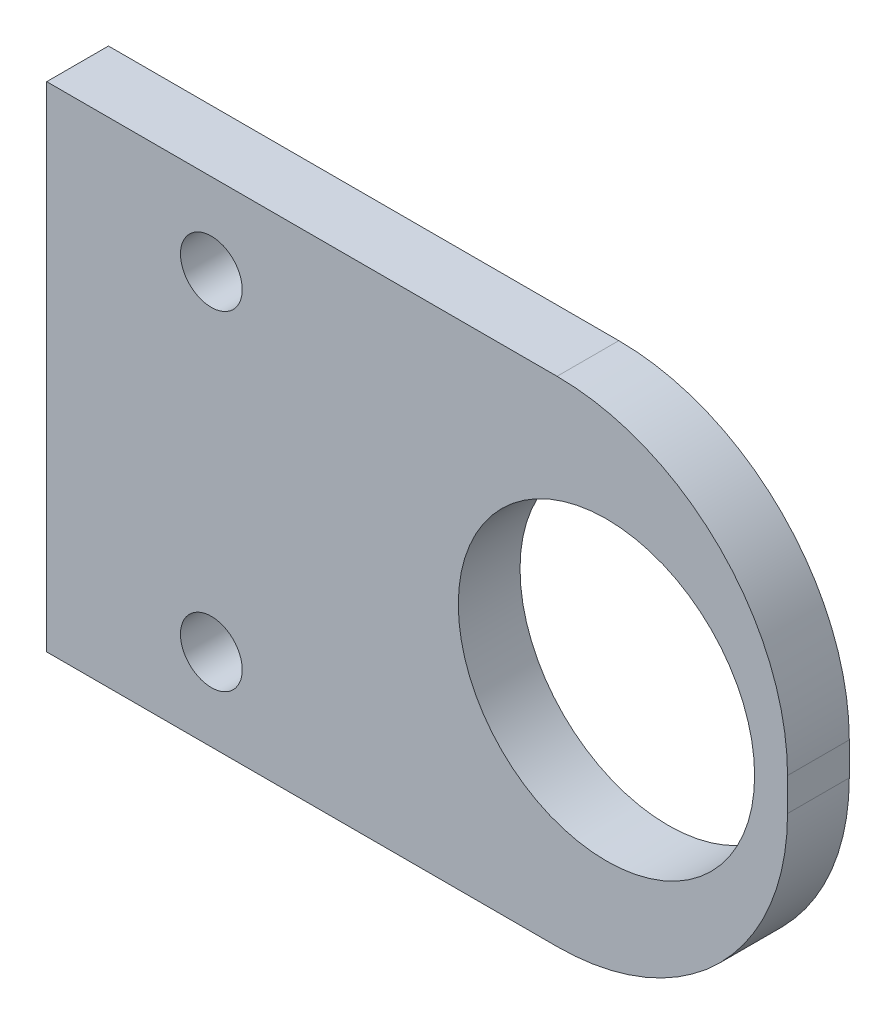
ISO-10303-21;
HEADER;
FILE_DESCRIPTION(('STEP AP214'),'2;1');
FILE_NAME('part.step','',(''),(''),'','','');
FILE_SCHEMA(('AUTOMOTIVE_DESIGN { 1 0 10303 214 1 1 1 1 }'));
ENDSEC;
DATA;
#1=APPLICATION_CONTEXT('core data for automotive mechanical design processes');
#2=APPLICATION_PROTOCOL_DEFINITION('international standard','automotive_design',2000,#1);
#3=PRODUCT_CONTEXT('',#1,'mechanical');
#4=PRODUCT('Part','Part','',(#3));
#5=PRODUCT_RELATED_PRODUCT_CATEGORY('part','',(#4));
#6=PRODUCT_DEFINITION_FORMATION('','',#4);
#7=PRODUCT_DEFINITION_CONTEXT('part definition',#1,'design');
#8=PRODUCT_DEFINITION('design','',#6,#7);
#9=PRODUCT_DEFINITION_SHAPE('','',#8);
#10=(LENGTH_UNIT() NAMED_UNIT(*) SI_UNIT(.MILLI.,.METRE.));
#11=(NAMED_UNIT(*) PLANE_ANGLE_UNIT() SI_UNIT($,.RADIAN.));
#12=(NAMED_UNIT(*) SI_UNIT($,.STERADIAN.) SOLID_ANGLE_UNIT());
#13=UNCERTAINTY_MEASURE_WITH_UNIT(LENGTH_MEASURE(1.E-05),#10,'distance_accuracy_value','');
#14=(GEOMETRIC_REPRESENTATION_CONTEXT(3) GLOBAL_UNCERTAINTY_ASSIGNED_CONTEXT((#13)) GLOBAL_UNIT_ASSIGNED_CONTEXT((#10,
#11,#12)) REPRESENTATION_CONTEXT('',''));
#15=CARTESIAN_POINT('',(0.,0.,0.));
#16=DIRECTION('',(0.,0.,1.));
#17=DIRECTION('',(1.,0.,0.));
#18=AXIS2_PLACEMENT_3D('',#15,#16,#17);
#19=CARTESIAN_POINT('',(10.795,-1.27000000000001,4.7625));
#20=DIRECTION('',(0.,0.,1.));
#21=DIRECTION('',(1.,0.,0.));
#22=AXIS2_PLACEMENT_3D('',#19,#20,#21);
#23=PLANE('',#22);
#24=CARTESIAN_POINT('',(-15.875,12.7,4.7625));
#25=DIRECTION('',(0.,0.,1.));
#26=DIRECTION('',(1.,0.,0.));
#27=AXIS2_PLACEMENT_3D('',#24,#25,#26);
#28=CIRCLE('',#27,2.38125);
#29=CARTESIAN_POINT('',(-18.25625,12.7,4.7625));
#30=VERTEX_POINT('',#29);
#31=EDGE_CURVE('E148',#30,#30,#28,.T.);
#32=ORIENTED_EDGE('',*,*,#31,.F.);
#33=EDGE_LOOP('',(#32));
#34=FACE_BOUND('',#33,.T.);
#35=DIRECTION('',(0.,-1.,0.));
#36=VECTOR('',#35,1.);
#37=CARTESIAN_POINT('',(-28.575,19.05,4.7625));
#38=LINE('',#37,#36);
#39=CARTESIAN_POINT('',(-28.575,19.05,4.7625));
#40=VERTEX_POINT('',#39);
#41=CARTESIAN_POINT('',(-28.575,-19.05,4.7625));
#42=VERTEX_POINT('',#41);
#43=EDGE_CURVE('E149',#40,#42,#38,.T.);
#44=ORIENTED_EDGE('',*,*,#43,.T.);
#45=DIRECTION('',(1.,0.,0.));
#46=VECTOR('',#45,1.);
#47=CARTESIAN_POINT('',(-28.575,-19.05,4.7625));
#48=LINE('',#47,#46);
#49=CARTESIAN_POINT('',(10.7949999999999,-19.05,4.7625));
#50=VERTEX_POINT('',#49);
#51=EDGE_CURVE('E94',#42,#50,#48,.T.);
#52=ORIENTED_EDGE('',*,*,#51,.T.);
#53=CARTESIAN_POINT('',(10.795,-1.27000000000001,4.7625));
#54=DIRECTION('',(0.,0.,1.));
#55=DIRECTION('',(1.,0.,0.));
#56=AXIS2_PLACEMENT_3D('',#53,#54,#55);
#57=CIRCLE('',#56,17.78);
#58=CARTESIAN_POINT('',(28.575,-1.26999999999988,4.7625));
#59=VERTEX_POINT('',#58);
#60=EDGE_CURVE('E107',#50,#59,#57,.T.);
#61=ORIENTED_EDGE('',*,*,#60,.T.);
#62=DIRECTION('',(0.,1.,0.));
#63=VECTOR('',#62,1.);
#64=CARTESIAN_POINT('',(28.575,1.26999999999988,4.7625));
#65=LINE('',#64,#63);
#66=CARTESIAN_POINT('',(28.575,1.26999999999989,4.7625));
#67=VERTEX_POINT('',#66);
#68=EDGE_CURVE('E101',#59,#67,#65,.T.);
#69=ORIENTED_EDGE('',*,*,#68,.T.);
#70=CARTESIAN_POINT('',(10.795,1.27,4.7625));
#71=DIRECTION('',(0.,0.,1.));
#72=DIRECTION('',(-1.,0.,0.));
#73=AXIS2_PLACEMENT_3D('',#70,#71,#72);
#74=CIRCLE('',#73,17.78);
#75=CARTESIAN_POINT('',(10.7949999999999,19.05,4.7625));
#76=VERTEX_POINT('',#75);
#77=EDGE_CURVE('E105',#67,#76,#74,.T.);
#78=ORIENTED_EDGE('',*,*,#77,.T.);
#79=DIRECTION('',(-1.,0.,0.));
#80=VECTOR('',#79,1.);
#81=CARTESIAN_POINT('',(-28.575,19.05,4.7625));
#82=LINE('',#81,#80);
#83=EDGE_CURVE('E57',#76,#40,#82,.T.);
#84=ORIENTED_EDGE('',*,*,#83,.T.);
#85=EDGE_LOOP('',(#44,#52,#61,#69,#78,#84));
#86=FACE_BOUND('',#85,.T.);
#87=CARTESIAN_POINT('',(14.605,0.,4.7625));
#88=DIRECTION('',(0.,0.,1.));
#89=DIRECTION('',(1.,0.,0.));
#90=AXIS2_PLACEMENT_3D('',#87,#88,#89);
#91=CIRCLE('',#90,11.43);
#92=CARTESIAN_POINT('',(3.17500000000001,0.,4.7625));
#93=VERTEX_POINT('',#92);
#94=EDGE_CURVE('E136',#93,#93,#91,.T.);
#95=ORIENTED_EDGE('',*,*,#94,.F.);
#96=EDGE_LOOP('',(#95));
#97=FACE_BOUND('',#96,.T.);
#98=CARTESIAN_POINT('',(-15.875,-12.7,4.7625));
#99=DIRECTION('',(0.,0.,1.));
#100=DIRECTION('',(1.,0.,0.));
#101=AXIS2_PLACEMENT_3D('',#98,#99,#100);
#102=CIRCLE('',#101,2.38125);
#103=CARTESIAN_POINT('',(-18.25625,-12.7,4.7625));
#104=VERTEX_POINT('',#103);
#105=EDGE_CURVE('E194',#104,#104,#102,.T.);
#106=ORIENTED_EDGE('',*,*,#105,.F.);
#107=EDGE_LOOP('',(#106));
#108=FACE_BOUND('',#107,.T.);
#109=ADVANCED_FACE('F40',(#34,#86,#97,#108),#23,.T.);
#110=CARTESIAN_POINT('',(10.795,-1.27000000000001,0.));
#111=DIRECTION('',(0.,0.,1.));
#112=DIRECTION('',(1.,0.,0.));
#113=AXIS2_PLACEMENT_3D('',#110,#111,#112);
#114=PLANE('',#113);
#115=DIRECTION('',(0.,-1.,0.));
#116=VECTOR('',#115,1.);
#117=CARTESIAN_POINT('',(-28.575,19.05,0.));
#118=LINE('',#117,#116);
#119=CARTESIAN_POINT('',(-28.575,19.05,0.));
#120=VERTEX_POINT('',#119);
#121=CARTESIAN_POINT('',(-28.575,-19.05,0.));
#122=VERTEX_POINT('',#121);
#123=EDGE_CURVE('E142',#120,#122,#118,.T.);
#124=ORIENTED_EDGE('',*,*,#123,.F.);
#125=DIRECTION('',(-1.,0.,0.));
#126=VECTOR('',#125,1.);
#127=CARTESIAN_POINT('',(-28.575,19.05,0.));
#128=LINE('',#127,#126);
#129=CARTESIAN_POINT('',(10.7949999999999,19.05,0.));
#130=VERTEX_POINT('',#129);
#131=EDGE_CURVE('E86',#130,#120,#128,.T.);
#132=ORIENTED_EDGE('',*,*,#131,.F.);
#133=CARTESIAN_POINT('',(10.795,1.27,0.));
#134=DIRECTION('',(0.,0.,1.));
#135=DIRECTION('',(-1.,0.,0.));
#136=AXIS2_PLACEMENT_3D('',#133,#134,#135);
#137=CIRCLE('',#136,17.78);
#138=CARTESIAN_POINT('',(28.575,1.26999999999989,0.));
#139=VERTEX_POINT('',#138);
#140=EDGE_CURVE('E80',#139,#130,#137,.T.);
#141=ORIENTED_EDGE('',*,*,#140,.F.);
#142=DIRECTION('',(0.,1.,0.));
#143=VECTOR('',#142,1.);
#144=CARTESIAN_POINT('',(28.575,1.26999999999988,0.));
#145=LINE('',#144,#143);
#146=CARTESIAN_POINT('',(28.575,-1.26999999999988,0.));
#147=VERTEX_POINT('',#146);
#148=EDGE_CURVE('E116',#147,#139,#145,.T.);
#149=ORIENTED_EDGE('',*,*,#148,.F.);
#150=CARTESIAN_POINT('',(10.795,-1.27000000000001,0.));
#151=DIRECTION('',(0.,0.,1.));
#152=DIRECTION('',(1.,0.,0.));
#153=AXIS2_PLACEMENT_3D('',#150,#151,#152);
#154=CIRCLE('',#153,17.78);
#155=CARTESIAN_POINT('',(10.7949999999999,-19.05,0.));
#156=VERTEX_POINT('',#155);
#157=EDGE_CURVE('E168',#156,#147,#154,.T.);
#158=ORIENTED_EDGE('',*,*,#157,.F.);
#159=DIRECTION('',(1.,0.,0.));
#160=VECTOR('',#159,1.);
#161=CARTESIAN_POINT('',(-28.575,-19.05,0.));
#162=LINE('',#161,#160);
#163=EDGE_CURVE('E164',#122,#156,#162,.T.);
#164=ORIENTED_EDGE('',*,*,#163,.F.);
#165=EDGE_LOOP('',(#124,#132,#141,#149,#158,#164));
#166=FACE_BOUND('',#165,.T.);
#167=CARTESIAN_POINT('',(14.605,0.,0.));
#168=DIRECTION('',(0.,0.,1.));
#169=DIRECTION('',(1.,0.,0.));
#170=AXIS2_PLACEMENT_3D('',#167,#168,#169);
#171=CIRCLE('',#170,11.43);
#172=CARTESIAN_POINT('',(3.17500000000001,0.,0.));
#173=VERTEX_POINT('',#172);
#174=EDGE_CURVE('E143',#173,#173,#171,.T.);
#175=ORIENTED_EDGE('',*,*,#174,.T.);
#176=EDGE_LOOP('',(#175));
#177=FACE_BOUND('',#176,.T.);
#178=CARTESIAN_POINT('',(-15.875,12.7,0.));
#179=DIRECTION('',(0.,0.,1.));
#180=DIRECTION('',(1.,0.,0.));
#181=AXIS2_PLACEMENT_3D('',#178,#179,#180);
#182=CIRCLE('',#181,2.38125);
#183=CARTESIAN_POINT('',(-18.25625,12.7,0.));
#184=VERTEX_POINT('',#183);
#185=EDGE_CURVE('E144',#184,#184,#182,.T.);
#186=ORIENTED_EDGE('',*,*,#185,.T.);
#187=EDGE_LOOP('',(#186));
#188=FACE_BOUND('',#187,.T.);
#189=CARTESIAN_POINT('',(-15.875,-12.7,0.));
#190=DIRECTION('',(0.,0.,1.));
#191=DIRECTION('',(1.,0.,0.));
#192=AXIS2_PLACEMENT_3D('',#189,#190,#191);
#193=CIRCLE('',#192,2.38125);
#194=CARTESIAN_POINT('',(-18.25625,-12.7,0.));
#195=VERTEX_POINT('',#194);
#196=EDGE_CURVE('E192',#195,#195,#193,.T.);
#197=ORIENTED_EDGE('',*,*,#196,.T.);
#198=EDGE_LOOP('',(#197));
#199=FACE_BOUND('',#198,.T.);
#200=ADVANCED_FACE('F181',(#166,#177,#188,#199),#114,.F.);
#201=CARTESIAN_POINT('',(-28.575,19.05,4.7625));
#202=DIRECTION('',(1.,0.,0.));
#203=DIRECTION('',(0.,1.,0.));
#204=AXIS2_PLACEMENT_3D('',#201,#202,#203);
#205=PLANE('',#204);
#206=ORIENTED_EDGE('',*,*,#123,.T.);
#207=DIRECTION('',(0.,0.,-1.));
#208=VECTOR('',#207,1.);
#209=CARTESIAN_POINT('',(-28.575,-19.05,4.7625));
#210=LINE('',#209,#208);
#211=EDGE_CURVE('E12',#42,#122,#210,.T.);
#212=ORIENTED_EDGE('',*,*,#211,.F.);
#213=ORIENTED_EDGE('',*,*,#43,.F.);
#214=DIRECTION('',(0.,0.,-1.));
#215=VECTOR('',#214,1.);
#216=CARTESIAN_POINT('',(-28.575,19.05,4.7625));
#217=LINE('',#216,#215);
#218=EDGE_CURVE('E124',#40,#120,#217,.T.);
#219=ORIENTED_EDGE('',*,*,#218,.T.);
#220=EDGE_LOOP('',(#206,#212,#213,#219));
#221=FACE_BOUND('',#220,.T.);
#222=ADVANCED_FACE('F42',(#221),#205,.F.);
#223=CARTESIAN_POINT('',(-28.575,-19.05,4.7625));
#224=DIRECTION('',(0.,1.,0.));
#225=DIRECTION('',(0.,0.,1.));
#226=AXIS2_PLACEMENT_3D('',#223,#224,#225);
#227=PLANE('',#226);
#228=ORIENTED_EDGE('',*,*,#163,.T.);
#229=DIRECTION('',(0.,0.,-1.));
#230=VECTOR('',#229,1.);
#231=CARTESIAN_POINT('',(10.7949999999999,-19.05,4.7625));
#232=LINE('',#231,#230);
#233=EDGE_CURVE('E49',#50,#156,#232,.T.);
#234=ORIENTED_EDGE('',*,*,#233,.F.);
#235=ORIENTED_EDGE('',*,*,#51,.F.);
#236=ORIENTED_EDGE('',*,*,#211,.T.);
#237=EDGE_LOOP('',(#228,#234,#235,#236));
#238=FACE_BOUND('',#237,.T.);
#239=ADVANCED_FACE('F163',(#238),#227,.F.);
#240=CARTESIAN_POINT('',(10.795,-1.27000000000001,4.7625));
#241=DIRECTION('',(0.,0.,-1.));
#242=DIRECTION('',(-1.,0.,0.));
#243=AXIS2_PLACEMENT_3D('',#240,#241,#242);
#244=CYLINDRICAL_SURFACE('',#243,17.78);
#245=ORIENTED_EDGE('',*,*,#157,.T.);
#246=DIRECTION('',(0.,0.,-1.));
#247=VECTOR('',#246,1.);
#248=CARTESIAN_POINT('',(28.575,-1.26999999999988,4.7625));
#249=LINE('',#248,#247);
#250=EDGE_CURVE('E117',#59,#147,#249,.T.);
#251=ORIENTED_EDGE('',*,*,#250,.F.);
#252=ORIENTED_EDGE('',*,*,#60,.F.);
#253=ORIENTED_EDGE('',*,*,#233,.T.);
#254=EDGE_LOOP('',(#245,#251,#252,#253));
#255=FACE_BOUND('',#254,.T.);
#256=ADVANCED_FACE('F167',(#255),#244,.T.);
#257=CARTESIAN_POINT('',(28.575,1.26999999999988,4.7625));
#258=DIRECTION('',(-1.,0.,0.));
#259=DIRECTION('',(0.,0.,1.));
#260=AXIS2_PLACEMENT_3D('',#257,#258,#259);
#261=PLANE('',#260);
#262=ORIENTED_EDGE('',*,*,#148,.T.);
#263=DIRECTION('',(0.,0.,-1.));
#264=VECTOR('',#263,1.);
#265=CARTESIAN_POINT('',(28.575,1.26999999999989,4.7625));
#266=LINE('',#265,#264);
#267=EDGE_CURVE('E113',#67,#139,#266,.T.);
#268=ORIENTED_EDGE('',*,*,#267,.F.);
#269=ORIENTED_EDGE('',*,*,#68,.F.);
#270=ORIENTED_EDGE('',*,*,#250,.T.);
#271=EDGE_LOOP('',(#262,#268,#269,#270));
#272=FACE_BOUND('',#271,.T.);
#273=ADVANCED_FACE('F114',(#272),#261,.F.);
#274=CARTESIAN_POINT('',(10.795,1.27,4.7625));
#275=DIRECTION('',(0.,0.,-1.));
#276=DIRECTION('',(-1.,0.,0.));
#277=AXIS2_PLACEMENT_3D('',#274,#275,#276);
#278=CYLINDRICAL_SURFACE('',#277,17.78);
#279=ORIENTED_EDGE('',*,*,#140,.T.);
#280=DIRECTION('',(0.,0.,-1.));
#281=VECTOR('',#280,1.);
#282=CARTESIAN_POINT('',(10.7949999999999,19.05,4.7625));
#283=LINE('',#282,#281);
#284=EDGE_CURVE('E118',#76,#130,#283,.T.);
#285=ORIENTED_EDGE('',*,*,#284,.F.);
#286=ORIENTED_EDGE('',*,*,#77,.F.);
#287=ORIENTED_EDGE('',*,*,#267,.T.);
#288=EDGE_LOOP('',(#279,#285,#286,#287));
#289=FACE_BOUND('',#288,.T.);
#290=ADVANCED_FACE('F120',(#289),#278,.T.);
#291=CARTESIAN_POINT('',(-28.575,19.05,4.7625));
#292=DIRECTION('',(0.,-1.,0.));
#293=DIRECTION('',(0.,0.,-1.));
#294=AXIS2_PLACEMENT_3D('',#291,#292,#293);
#295=PLANE('',#294);
#296=ORIENTED_EDGE('',*,*,#131,.T.);
#297=ORIENTED_EDGE('',*,*,#218,.F.);
#298=ORIENTED_EDGE('',*,*,#83,.F.);
#299=ORIENTED_EDGE('',*,*,#284,.T.);
#300=EDGE_LOOP('',(#296,#297,#298,#299));
#301=FACE_BOUND('',#300,.T.);
#302=ADVANCED_FACE('F215',(#301),#295,.F.);
#303=CARTESIAN_POINT('',(14.605,0.,4.7625));
#304=DIRECTION('',(0.,0.,-1.));
#305=DIRECTION('',(-1.,0.,0.));
#306=AXIS2_PLACEMENT_3D('',#303,#304,#305);
#307=CYLINDRICAL_SURFACE('',#306,11.43);
#308=CARTESIAN_POINT('',(3.17500000000001,0.,4.7625));
#309=CARTESIAN_POINT('',(3.17500000000001,0.,4.712890625));
#310=CARTESIAN_POINT('',(3.17500000000001,0.,4.66328125));
#311=CARTESIAN_POINT('',(3.17500000000001,0.,4.5640625));
#312=CARTESIAN_POINT('',(3.17500000000001,0.,4.514453125));
#313=CARTESIAN_POINT('',(3.17500000000001,0.,4.415234375));
#314=CARTESIAN_POINT('',(3.17500000000001,0.,4.365625));
#315=CARTESIAN_POINT('',(3.17500000000001,0.,4.26640625));
#316=CARTESIAN_POINT('',(3.17500000000001,0.,4.216796875));
#317=CARTESIAN_POINT('',(3.17500000000001,0.,4.117578125));
#318=CARTESIAN_POINT('',(3.17500000000001,0.,4.06796875));
#319=CARTESIAN_POINT('',(3.17500000000001,0.,3.96875));
#320=CARTESIAN_POINT('',(3.17500000000001,0.,3.919140625));
#321=CARTESIAN_POINT('',(3.17500000000001,0.,3.819921875));
#322=CARTESIAN_POINT('',(3.17500000000001,0.,3.7703125));
#323=CARTESIAN_POINT('',(3.17500000000001,0.,3.67109375));
#324=CARTESIAN_POINT('',(3.17500000000001,0.,3.621484375));
#325=CARTESIAN_POINT('',(3.17500000000001,0.,3.522265625));
#326=CARTESIAN_POINT('',(3.17500000000001,0.,3.47265625));
#327=CARTESIAN_POINT('',(3.17500000000001,0.,3.3734375));
#328=CARTESIAN_POINT('',(3.17500000000001,0.,3.323828125));
#329=CARTESIAN_POINT('',(3.17500000000001,0.,3.224609375));
#330=CARTESIAN_POINT('',(3.17500000000001,0.,3.175));
#331=CARTESIAN_POINT('',(3.17500000000001,0.,3.07578125));
#332=CARTESIAN_POINT('',(3.17500000000001,0.,3.026171875));
#333=CARTESIAN_POINT('',(3.17500000000001,0.,2.926953125));
#334=CARTESIAN_POINT('',(3.17500000000001,0.,2.87734375));
#335=CARTESIAN_POINT('',(3.17500000000001,0.,2.778125));
#336=CARTESIAN_POINT('',(3.17500000000001,0.,2.728515625));
#337=CARTESIAN_POINT('',(3.17500000000001,0.,2.629296875));
#338=CARTESIAN_POINT('',(3.17500000000001,0.,2.5796875));
#339=CARTESIAN_POINT('',(3.17500000000001,0.,2.48046875));
#340=CARTESIAN_POINT('',(3.17500000000001,0.,2.430859375));
#341=CARTESIAN_POINT('',(3.17500000000001,0.,2.331640625));
#342=CARTESIAN_POINT('',(3.17500000000001,0.,2.28203125));
#343=CARTESIAN_POINT('',(3.17500000000001,0.,2.1828125));
#344=CARTESIAN_POINT('',(3.17500000000001,0.,2.133203125));
#345=CARTESIAN_POINT('',(3.17500000000001,0.,2.033984375));
#346=CARTESIAN_POINT('',(3.17500000000001,0.,1.984375));
#347=CARTESIAN_POINT('',(3.17500000000001,0.,1.88515625));
#348=CARTESIAN_POINT('',(3.17500000000001,0.,1.835546875));
#349=CARTESIAN_POINT('',(3.17500000000001,0.,1.736328125));
#350=CARTESIAN_POINT('',(3.17500000000001,0.,1.68671875));
#351=CARTESIAN_POINT('',(3.17500000000001,0.,1.5875));
#352=CARTESIAN_POINT('',(3.17500000000001,0.,1.537890625));
#353=CARTESIAN_POINT('',(3.17500000000001,0.,1.438671875));
#354=CARTESIAN_POINT('',(3.17500000000001,0.,1.3890625));
#355=CARTESIAN_POINT('',(3.17500000000001,0.,1.28984375));
#356=CARTESIAN_POINT('',(3.17500000000001,0.,1.240234375));
#357=CARTESIAN_POINT('',(3.17500000000001,0.,1.141015625));
#358=CARTESIAN_POINT('',(3.17500000000001,0.,1.09140625));
#359=CARTESIAN_POINT('',(3.17500000000001,0.,0.9921875));
#360=CARTESIAN_POINT('',(3.17500000000001,0.,0.942578125));
#361=CARTESIAN_POINT('',(3.17500000000001,0.,0.843359375));
#362=CARTESIAN_POINT('',(3.17500000000001,0.,0.79375));
#363=CARTESIAN_POINT('',(3.17500000000001,0.,0.69453125));
#364=CARTESIAN_POINT('',(3.17500000000001,0.,0.644921875));
#365=CARTESIAN_POINT('',(3.17500000000001,0.,0.545703125));
#366=CARTESIAN_POINT('',(3.17500000000001,0.,0.49609375));
#367=CARTESIAN_POINT('',(3.17500000000001,0.,0.396875));
#368=CARTESIAN_POINT('',(3.17500000000001,0.,0.347265625));
#369=CARTESIAN_POINT('',(3.17500000000001,0.,0.248046875));
#370=CARTESIAN_POINT('',(3.17500000000001,0.,0.1984375));
#371=CARTESIAN_POINT('',(3.17500000000001,0.,0.09921875));
#372=CARTESIAN_POINT('',(3.17500000000001,0.,0.049609375));
#373=CARTESIAN_POINT('',(3.17500000000001,0.,0.));
#374=B_SPLINE_CURVE_WITH_KNOTS('',3,(#308,#309,#310,#311,#312,#313,#314,#315,#316,#317,#318,
#319,#320,#321,#322,#323,#324,#325,#326,#327,#328,#329,#330,#331,#332,#333,#334,#335,#336,#337,
#338,#339,#340,#341,#342,#343,#344,#345,#346,#347,#348,#349,#350,#351,#352,#353,#354,#355,#356,
#357,#358,#359,#360,#361,#362,#363,#364,#365,#366,#367,#368,#369,#370,#371,#372,#373),
.UNSPECIFIED.,.F.,.F.,(4,2,2,2,2,2,2,2,2,2,2,2,2,2,2,2,2,2,2,2,2,2,2,2,2,2,2,2,2,2,2,2,4),(0.,
0.148828124999999,0.297656249999999,0.446484374999999,0.595312499999999,0.744140625,0.89296875,
1.041796875,1.190625,1.339453125,1.48828125,1.637109375,1.7859375,1.934765625,2.08359375,
2.232421875,2.38125,2.530078125,2.67890625,2.827734375,2.9765625,3.125390625,3.27421875,
3.423046875,3.571875,3.720703125,3.86953125,4.018359375,4.1671875,4.316015625,4.46484375,
4.613671875,4.7625),.UNSPECIFIED.);
#375=EDGE_CURVE('BSEAM212',#93,#173,#374,.T.);
#376=ORIENTED_EDGE('',*,*,#94,.T.);
#377=ORIENTED_EDGE('',*,*,#174,.F.);
#378=ORIENTED_EDGE('',*,*,#375,.T.);
#379=ORIENTED_EDGE('',*,*,#375,.F.);
#380=EDGE_LOOP('',(#376,#378,#377,#379));
#381=FACE_BOUND('',#380,.T.);
#382=ADVANCED_FACE('F212',(#381),#307,.F.);
#383=CARTESIAN_POINT('',(-15.875,12.7,4.7625));
#384=DIRECTION('',(0.,0.,-1.));
#385=DIRECTION('',(-1.,0.,0.));
#386=AXIS2_PLACEMENT_3D('',#383,#384,#385);
#387=CYLINDRICAL_SURFACE('',#386,2.38125);
#388=CARTESIAN_POINT('',(-18.25625,12.7,4.7625));
#389=CARTESIAN_POINT('',(-18.25625,12.7,4.712890625));
#390=CARTESIAN_POINT('',(-18.25625,12.7,4.66328125));
#391=CARTESIAN_POINT('',(-18.25625,12.7,4.5640625));
#392=CARTESIAN_POINT('',(-18.25625,12.7,4.514453125));
#393=CARTESIAN_POINT('',(-18.25625,12.7,4.415234375));
#394=CARTESIAN_POINT('',(-18.25625,12.7,4.365625));
#395=CARTESIAN_POINT('',(-18.25625,12.7,4.26640625));
#396=CARTESIAN_POINT('',(-18.25625,12.7,4.216796875));
#397=CARTESIAN_POINT('',(-18.25625,12.7,4.117578125));
#398=CARTESIAN_POINT('',(-18.25625,12.7,4.06796875));
#399=CARTESIAN_POINT('',(-18.25625,12.7,3.96875));
#400=CARTESIAN_POINT('',(-18.25625,12.7,3.919140625));
#401=CARTESIAN_POINT('',(-18.25625,12.7,3.819921875));
#402=CARTESIAN_POINT('',(-18.25625,12.7,3.7703125));
#403=CARTESIAN_POINT('',(-18.25625,12.7,3.67109375));
#404=CARTESIAN_POINT('',(-18.25625,12.7,3.621484375));
#405=CARTESIAN_POINT('',(-18.25625,12.7,3.522265625));
#406=CARTESIAN_POINT('',(-18.25625,12.7,3.47265625));
#407=CARTESIAN_POINT('',(-18.25625,12.7,3.3734375));
#408=CARTESIAN_POINT('',(-18.25625,12.7,3.323828125));
#409=CARTESIAN_POINT('',(-18.25625,12.7,3.224609375));
#410=CARTESIAN_POINT('',(-18.25625,12.7,3.175));
#411=CARTESIAN_POINT('',(-18.25625,12.7,3.07578125));
#412=CARTESIAN_POINT('',(-18.25625,12.7,3.026171875));
#413=CARTESIAN_POINT('',(-18.25625,12.7,2.926953125));
#414=CARTESIAN_POINT('',(-18.25625,12.7,2.87734375));
#415=CARTESIAN_POINT('',(-18.25625,12.7,2.778125));
#416=CARTESIAN_POINT('',(-18.25625,12.7,2.728515625));
#417=CARTESIAN_POINT('',(-18.25625,12.7,2.629296875));
#418=CARTESIAN_POINT('',(-18.25625,12.7,2.5796875));
#419=CARTESIAN_POINT('',(-18.25625,12.7,2.48046875));
#420=CARTESIAN_POINT('',(-18.25625,12.7,2.430859375));
#421=CARTESIAN_POINT('',(-18.25625,12.7,2.331640625));
#422=CARTESIAN_POINT('',(-18.25625,12.7,2.28203125));
#423=CARTESIAN_POINT('',(-18.25625,12.7,2.1828125));
#424=CARTESIAN_POINT('',(-18.25625,12.7,2.133203125));
#425=CARTESIAN_POINT('',(-18.25625,12.7,2.033984375));
#426=CARTESIAN_POINT('',(-18.25625,12.7,1.984375));
#427=CARTESIAN_POINT('',(-18.25625,12.7,1.88515625));
#428=CARTESIAN_POINT('',(-18.25625,12.7,1.835546875));
#429=CARTESIAN_POINT('',(-18.25625,12.7,1.736328125));
#430=CARTESIAN_POINT('',(-18.25625,12.7,1.68671875));
#431=CARTESIAN_POINT('',(-18.25625,12.7,1.5875));
#432=CARTESIAN_POINT('',(-18.25625,12.7,1.537890625));
#433=CARTESIAN_POINT('',(-18.25625,12.7,1.438671875));
#434=CARTESIAN_POINT('',(-18.25625,12.7,1.3890625));
#435=CARTESIAN_POINT('',(-18.25625,12.7,1.28984375));
#436=CARTESIAN_POINT('',(-18.25625,12.7,1.240234375));
#437=CARTESIAN_POINT('',(-18.25625,12.7,1.141015625));
#438=CARTESIAN_POINT('',(-18.25625,12.7,1.09140625));
#439=CARTESIAN_POINT('',(-18.25625,12.7,0.992187499999999));
#440=CARTESIAN_POINT('',(-18.25625,12.7,0.942578124999999));
#441=CARTESIAN_POINT('',(-18.25625,12.7,0.843359375));
#442=CARTESIAN_POINT('',(-18.25625,12.7,0.79375));
#443=CARTESIAN_POINT('',(-18.25625,12.7,0.69453125));
#444=CARTESIAN_POINT('',(-18.25625,12.7,0.644921875));
#445=CARTESIAN_POINT('',(-18.25625,12.7,0.545703125));
#446=CARTESIAN_POINT('',(-18.25625,12.7,0.49609375));
#447=CARTESIAN_POINT('',(-18.25625,12.7,0.396875));
#448=CARTESIAN_POINT('',(-18.25625,12.7,0.347265625));
#449=CARTESIAN_POINT('',(-18.25625,12.7,0.248046875));
#450=CARTESIAN_POINT('',(-18.25625,12.7,0.1984375));
#451=CARTESIAN_POINT('',(-18.25625,12.7,0.09921875));
#452=CARTESIAN_POINT('',(-18.25625,12.7,0.049609375));
#453=CARTESIAN_POINT('',(-18.25625,12.7,0.));
#454=B_SPLINE_CURVE_WITH_KNOTS('',3,(#388,#389,#390,#391,#392,#393,#394,#395,#396,#397,#398,
#399,#400,#401,#402,#403,#404,#405,#406,#407,#408,#409,#410,#411,#412,#413,#414,#415,#416,#417,
#418,#419,#420,#421,#422,#423,#424,#425,#426,#427,#428,#429,#430,#431,#432,#433,#434,#435,#436,
#437,#438,#439,#440,#441,#442,#443,#444,#445,#446,#447,#448,#449,#450,#451,#452,#453),
.UNSPECIFIED.,.F.,.F.,(4,2,2,2,2,2,2,2,2,2,2,2,2,2,2,2,2,2,2,2,2,2,2,2,2,2,2,2,2,2,2,2,4),(0.,
0.148828125,0.29765625,0.446484375,0.5953125,0.744140625,0.892968750000001,1.041796875,1.190625,
1.339453125,1.48828125,1.637109375,1.7859375,1.934765625,2.08359375,2.232421875,2.38125,
2.530078125,2.67890625,2.827734375,2.9765625,3.125390625,3.27421875,3.423046875,3.571875,
3.720703125,3.86953125,4.018359375,4.1671875,4.316015625,4.46484375,4.613671875,4.7625),.UNSPECIFIED.);
#455=EDGE_CURVE('BSEAM204',#30,#184,#454,.T.);
#456=ORIENTED_EDGE('',*,*,#31,.T.);
#457=ORIENTED_EDGE('',*,*,#185,.F.);
#458=ORIENTED_EDGE('',*,*,#455,.T.);
#459=ORIENTED_EDGE('',*,*,#455,.F.);
#460=EDGE_LOOP('',(#456,#458,#457,#459));
#461=FACE_BOUND('',#460,.T.);
#462=ADVANCED_FACE('F204',(#461),#387,.F.);
#463=CARTESIAN_POINT('',(-15.875,-12.7,4.7625));
#464=DIRECTION('',(0.,0.,-1.));
#465=DIRECTION('',(-1.,0.,0.));
#466=AXIS2_PLACEMENT_3D('',#463,#464,#465);
#467=CYLINDRICAL_SURFACE('',#466,2.38125);
#468=CARTESIAN_POINT('',(-18.25625,-12.7,4.7625));
#469=CARTESIAN_POINT('',(-18.25625,-12.7,4.712890625));
#470=CARTESIAN_POINT('',(-18.25625,-12.7,4.66328125));
#471=CARTESIAN_POINT('',(-18.25625,-12.7,4.5640625));
#472=CARTESIAN_POINT('',(-18.25625,-12.7,4.514453125));
#473=CARTESIAN_POINT('',(-18.25625,-12.7,4.415234375));
#474=CARTESIAN_POINT('',(-18.25625,-12.7,4.365625));
#475=CARTESIAN_POINT('',(-18.25625,-12.7,4.26640625));
#476=CARTESIAN_POINT('',(-18.25625,-12.7,4.216796875));
#477=CARTESIAN_POINT('',(-18.25625,-12.7,4.117578125));
#478=CARTESIAN_POINT('',(-18.25625,-12.7,4.06796875));
#479=CARTESIAN_POINT('',(-18.25625,-12.7,3.96875));
#480=CARTESIAN_POINT('',(-18.25625,-12.7,3.919140625));
#481=CARTESIAN_POINT('',(-18.25625,-12.7,3.819921875));
#482=CARTESIAN_POINT('',(-18.25625,-12.7,3.7703125));
#483=CARTESIAN_POINT('',(-18.25625,-12.7,3.67109375));
#484=CARTESIAN_POINT('',(-18.25625,-12.7,3.621484375));
#485=CARTESIAN_POINT('',(-18.25625,-12.7,3.522265625));
#486=CARTESIAN_POINT('',(-18.25625,-12.7,3.47265625));
#487=CARTESIAN_POINT('',(-18.25625,-12.7,3.3734375));
#488=CARTESIAN_POINT('',(-18.25625,-12.7,3.323828125));
#489=CARTESIAN_POINT('',(-18.25625,-12.7,3.224609375));
#490=CARTESIAN_POINT('',(-18.25625,-12.7,3.175));
#491=CARTESIAN_POINT('',(-18.25625,-12.7,3.07578125));
#492=CARTESIAN_POINT('',(-18.25625,-12.7,3.026171875));
#493=CARTESIAN_POINT('',(-18.25625,-12.7,2.926953125));
#494=CARTESIAN_POINT('',(-18.25625,-12.7,2.87734375));
#495=CARTESIAN_POINT('',(-18.25625,-12.7,2.778125));
#496=CARTESIAN_POINT('',(-18.25625,-12.7,2.728515625));
#497=CARTESIAN_POINT('',(-18.25625,-12.7,2.629296875));
#498=CARTESIAN_POINT('',(-18.25625,-12.7,2.5796875));
#499=CARTESIAN_POINT('',(-18.25625,-12.7,2.48046875));
#500=CARTESIAN_POINT('',(-18.25625,-12.7,2.430859375));
#501=CARTESIAN_POINT('',(-18.25625,-12.7,2.331640625));
#502=CARTESIAN_POINT('',(-18.25625,-12.7,2.28203125));
#503=CARTESIAN_POINT('',(-18.25625,-12.7,2.1828125));
#504=CARTESIAN_POINT('',(-18.25625,-12.7,2.133203125));
#505=CARTESIAN_POINT('',(-18.25625,-12.7,2.033984375));
#506=CARTESIAN_POINT('',(-18.25625,-12.7,1.984375));
#507=CARTESIAN_POINT('',(-18.25625,-12.7,1.88515625));
#508=CARTESIAN_POINT('',(-18.25625,-12.7,1.835546875));
#509=CARTESIAN_POINT('',(-18.25625,-12.7,1.736328125));
#510=CARTESIAN_POINT('',(-18.25625,-12.7,1.68671875));
#511=CARTESIAN_POINT('',(-18.25625,-12.7,1.5875));
#512=CARTESIAN_POINT('',(-18.25625,-12.7,1.537890625));
#513=CARTESIAN_POINT('',(-18.25625,-12.7,1.438671875));
#514=CARTESIAN_POINT('',(-18.25625,-12.7,1.3890625));
#515=CARTESIAN_POINT('',(-18.25625,-12.7,1.28984375));
#516=CARTESIAN_POINT('',(-18.25625,-12.7,1.240234375));
#517=CARTESIAN_POINT('',(-18.25625,-12.7,1.141015625));
#518=CARTESIAN_POINT('',(-18.25625,-12.7,1.09140625));
#519=CARTESIAN_POINT('',(-18.25625,-12.7,0.992187499999999));
#520=CARTESIAN_POINT('',(-18.25625,-12.7,0.942578124999999));
#521=CARTESIAN_POINT('',(-18.25625,-12.7,0.843359375));
#522=CARTESIAN_POINT('',(-18.25625,-12.7,0.79375));
#523=CARTESIAN_POINT('',(-18.25625,-12.7,0.69453125));
#524=CARTESIAN_POINT('',(-18.25625,-12.7,0.644921875));
#525=CARTESIAN_POINT('',(-18.25625,-12.7,0.545703125));
#526=CARTESIAN_POINT('',(-18.25625,-12.7,0.49609375));
#527=CARTESIAN_POINT('',(-18.25625,-12.7,0.396875));
#528=CARTESIAN_POINT('',(-18.25625,-12.7,0.347265625));
#529=CARTESIAN_POINT('',(-18.25625,-12.7,0.248046875));
#530=CARTESIAN_POINT('',(-18.25625,-12.7,0.1984375));
#531=CARTESIAN_POINT('',(-18.25625,-12.7,0.09921875));
#532=CARTESIAN_POINT('',(-18.25625,-12.7,0.049609375));
#533=CARTESIAN_POINT('',(-18.25625,-12.7,0.));
#534=B_SPLINE_CURVE_WITH_KNOTS('',3,(#468,#469,#470,#471,#472,#473,#474,#475,#476,#477,#478,
#479,#480,#481,#482,#483,#484,#485,#486,#487,#488,#489,#490,#491,#492,#493,#494,#495,#496,#497,
#498,#499,#500,#501,#502,#503,#504,#505,#506,#507,#508,#509,#510,#511,#512,#513,#514,#515,#516,
#517,#518,#519,#520,#521,#522,#523,#524,#525,#526,#527,#528,#529,#530,#531,#532,#533),
.UNSPECIFIED.,.F.,.F.,(4,2,2,2,2,2,2,2,2,2,2,2,2,2,2,2,2,2,2,2,2,2,2,2,2,2,2,2,2,2,2,2,4),(0.,
0.148828125,0.29765625,0.446484375,0.5953125,0.744140625,0.892968750000001,1.041796875,1.190625,
1.339453125,1.48828125,1.637109375,1.7859375,1.934765625,2.08359375,2.232421875,2.38125,
2.530078125,2.67890625,2.827734375,2.9765625,3.125390625,3.27421875,3.423046875,3.571875,
3.720703125,3.86953125,4.018359375,4.1671875,4.316015625,4.46484375,4.613671875,4.7625),.UNSPECIFIED.);
#535=EDGE_CURVE('BSEAM291',#104,#195,#534,.T.);
#536=ORIENTED_EDGE('',*,*,#105,.T.);
#537=ORIENTED_EDGE('',*,*,#196,.F.);
#538=ORIENTED_EDGE('',*,*,#535,.T.);
#539=ORIENTED_EDGE('',*,*,#535,.F.);
#540=EDGE_LOOP('',(#536,#538,#537,#539));
#541=FACE_BOUND('',#540,.T.);
#542=ADVANCED_FACE('F291',(#541),#467,.F.);
#543=CLOSED_SHELL('',(#109,#200,#222,#239,#256,#273,#290,#302,#382,#462,#542));
#544=MANIFOLD_SOLID_BREP('B2',#543);
#545=ADVANCED_BREP_SHAPE_REPRESENTATION('',(#18,#544),#14);
#546=SHAPE_DEFINITION_REPRESENTATION(#9,#545);
ENDSEC;
END-ISO-10303-21;
